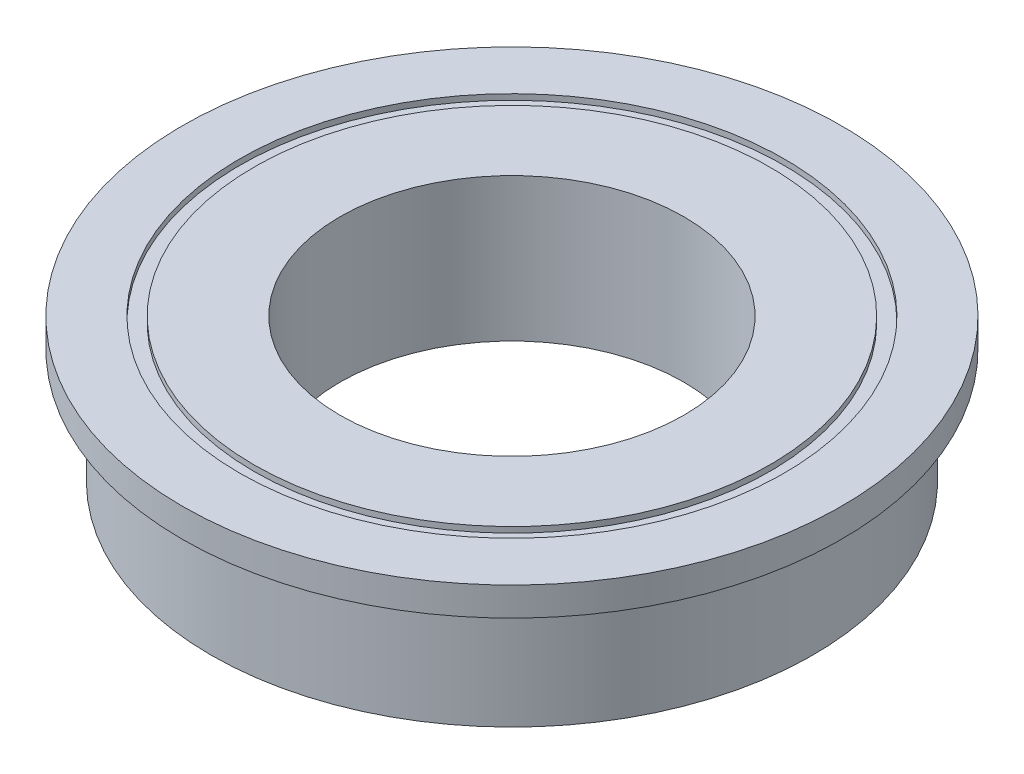
ISO-10303-21;
HEADER;
FILE_DESCRIPTION(('STEP AP214'),'2;1');
FILE_NAME('part.step','',(''),(''),'','','');
FILE_SCHEMA(('AUTOMOTIVE_DESIGN { 1 0 10303 214 1 1 1 1 }'));
ENDSEC;
DATA;
#1=APPLICATION_CONTEXT('core data for automotive mechanical design processes');
#2=APPLICATION_PROTOCOL_DEFINITION('international standard','automotive_design',2000,#1);
#3=PRODUCT_CONTEXT('',#1,'mechanical');
#4=PRODUCT('Part','Part','',(#3));
#5=PRODUCT_RELATED_PRODUCT_CATEGORY('part','',(#4));
#6=PRODUCT_DEFINITION_FORMATION('','',#4);
#7=PRODUCT_DEFINITION_CONTEXT('part definition',#1,'design');
#8=PRODUCT_DEFINITION('design','',#6,#7);
#9=PRODUCT_DEFINITION_SHAPE('','',#8);
#10=(LENGTH_UNIT() NAMED_UNIT(*) SI_UNIT(.MILLI.,.METRE.));
#11=(NAMED_UNIT(*) PLANE_ANGLE_UNIT() SI_UNIT($,.RADIAN.));
#12=(NAMED_UNIT(*) SI_UNIT($,.STERADIAN.) SOLID_ANGLE_UNIT());
#13=UNCERTAINTY_MEASURE_WITH_UNIT(LENGTH_MEASURE(1.E-05),#10,'distance_accuracy_value','');
#14=(GEOMETRIC_REPRESENTATION_CONTEXT(3) GLOBAL_UNCERTAINTY_ASSIGNED_CONTEXT((#13)) GLOBAL_UNIT_ASSIGNED_CONTEXT((#10,
#11,#12)) REPRESENTATION_CONTEXT('',''));
#15=CARTESIAN_POINT('',(0.,0.,0.));
#16=DIRECTION('',(0.,0.,1.));
#17=DIRECTION('',(1.,0.,0.));
#18=AXIS2_PLACEMENT_3D('',#15,#16,#17);
#19=CARTESIAN_POINT('',(0.,5.,0.));
#20=DIRECTION('',(0.,1.,0.));
#21=DIRECTION('',(0.,0.,1.));
#22=AXIS2_PLACEMENT_3D('',#19,#20,#21);
#23=PLANE('',#22);
#24=CARTESIAN_POINT('',(0.,5.,0.));
#25=DIRECTION('',(0.,1.,0.));
#26=DIRECTION('',(0.,0.,1.));
#27=AXIS2_PLACEMENT_3D('',#24,#25,#26);
#28=CIRCLE('',#27,6.);
#29=CARTESIAN_POINT('',(0.,5.,6.));
#30=VERTEX_POINT('',#29);
#31=EDGE_CURVE('E53',#30,#30,#28,.T.);
#32=ORIENTED_EDGE('',*,*,#31,.F.);
#33=EDGE_LOOP('',(#32));
#34=FACE_BOUND('',#33,.T.);
#35=CARTESIAN_POINT('',(0.,5.,0.));
#36=DIRECTION('',(0.,1.,0.));
#37=DIRECTION('',(0.,0.,1.));
#38=AXIS2_PLACEMENT_3D('',#35,#36,#37);
#39=CIRCLE('',#38,9.);
#40=CARTESIAN_POINT('',(0.,5.,9.));
#41=VERTEX_POINT('',#40);
#42=EDGE_CURVE('E77',#41,#41,#39,.T.);
#43=ORIENTED_EDGE('',*,*,#42,.T.);
#44=EDGE_LOOP('',(#43));
#45=FACE_BOUND('',#44,.T.);
#46=ADVANCED_FACE('F34',(#34,#45),#23,.T.);
#47=CARTESIAN_POINT('',(0.,0.,0.));
#48=DIRECTION('',(0.,1.,0.));
#49=DIRECTION('',(0.,0.,1.));
#50=AXIS2_PLACEMENT_3D('',#47,#48,#49);
#51=PLANE('',#50);
#52=CARTESIAN_POINT('',(0.,0.,0.));
#53=DIRECTION('',(0.,1.,0.));
#54=DIRECTION('',(0.,0.,1.));
#55=AXIS2_PLACEMENT_3D('',#52,#53,#54);
#56=CIRCLE('',#55,6.);
#57=CARTESIAN_POINT('',(0.,0.,6.));
#58=VERTEX_POINT('',#57);
#59=EDGE_CURVE('E45',#58,#58,#56,.T.);
#60=ORIENTED_EDGE('',*,*,#59,.T.);
#61=EDGE_LOOP('',(#60));
#62=FACE_BOUND('',#61,.T.);
#63=CARTESIAN_POINT('',(0.,0.,0.));
#64=DIRECTION('',(0.,-1.,0.));
#65=DIRECTION('',(0.,0.,-1.));
#66=AXIS2_PLACEMENT_3D('',#63,#64,#65);
#67=CIRCLE('',#66,9.);
#68=CARTESIAN_POINT('',(0.,0.,-9.));
#69=VERTEX_POINT('',#68);
#70=EDGE_CURVE('E65',#69,#69,#67,.T.);
#71=ORIENTED_EDGE('',*,*,#70,.T.);
#72=EDGE_LOOP('',(#71));
#73=FACE_BOUND('',#72,.T.);
#74=ADVANCED_FACE('F122',(#62,#73),#51,.F.);
#75=CARTESIAN_POINT('',(0.,0.,0.));
#76=DIRECTION('',(0.,-1.,0.));
#77=DIRECTION('',(0.,0.,-1.));
#78=AXIS2_PLACEMENT_3D('',#75,#76,#77);
#79=CIRCLE('',#78,9.5);
#80=CARTESIAN_POINT('',(0.,0.,-9.5));
#81=VERTEX_POINT('',#80);
#82=EDGE_CURVE('E59',#81,#81,#79,.T.);
#83=ORIENTED_EDGE('',*,*,#82,.F.);
#84=EDGE_LOOP('',(#83));
#85=FACE_BOUND('',#84,.T.);
#86=CARTESIAN_POINT('',(0.,0.,0.));
#87=DIRECTION('',(0.,1.,0.));
#88=DIRECTION('',(0.,0.,1.));
#89=AXIS2_PLACEMENT_3D('',#86,#87,#88);
#90=CIRCLE('',#89,10.5);
#91=CARTESIAN_POINT('',(0.,0.,10.5));
#92=VERTEX_POINT('',#91);
#93=EDGE_CURVE('E38',#92,#92,#90,.T.);
#94=ORIENTED_EDGE('',*,*,#93,.F.);
#95=EDGE_LOOP('',(#94));
#96=FACE_BOUND('',#95,.T.);
#97=ADVANCED_FACE('F127',(#85,#96),#51,.F.);
#98=CARTESIAN_POINT('',(0.,4.,0.));
#99=DIRECTION('',(0.,-1.,0.));
#100=DIRECTION('',(0.,0.,-1.));
#101=AXIS2_PLACEMENT_3D('',#98,#99,#100);
#102=CYLINDRICAL_SURFACE('',#101,10.5);
#103=CARTESIAN_POINT('',(0.,4.,0.));
#104=DIRECTION('',(0.,1.,0.));
#105=DIRECTION('',(0.,0.,1.));
#106=AXIS2_PLACEMENT_3D('',#103,#104,#105);
#107=CIRCLE('',#106,10.5);
#108=CARTESIAN_POINT('',(0.,4.,10.5));
#109=VERTEX_POINT('',#108);
#110=EDGE_CURVE('E10',#109,#109,#107,.T.);
#111=ORIENTED_EDGE('',*,*,#110,.F.);
#112=EDGE_LOOP('',(#111));
#113=FACE_BOUND('',#112,.T.);
#114=ORIENTED_EDGE('',*,*,#93,.T.);
#115=EDGE_LOOP('',(#114));
#116=FACE_BOUND('',#115,.T.);
#117=ADVANCED_FACE('F36',(#113,#116),#102,.T.);
#118=CARTESIAN_POINT('',(0.,4.,0.));
#119=DIRECTION('',(0.,-1.,0.));
#120=DIRECTION('',(0.,0.,-1.));
#121=AXIS2_PLACEMENT_3D('',#118,#119,#120);
#122=CYLINDRICAL_SURFACE('',#121,6.);
#123=ORIENTED_EDGE('',*,*,#59,.F.);
#124=EDGE_LOOP('',(#123));
#125=FACE_BOUND('',#124,.T.);
#126=ORIENTED_EDGE('',*,*,#31,.T.);
#127=EDGE_LOOP('',(#126));
#128=FACE_BOUND('',#127,.T.);
#129=ADVANCED_FACE('F114',(#125,#128),#122,.F.);
#130=CARTESIAN_POINT('',(0.,4.,0.));
#131=DIRECTION('',(0.,1.,0.));
#132=DIRECTION('',(0.,0.,1.));
#133=AXIS2_PLACEMENT_3D('',#130,#131,#132);
#134=PLANE('',#133);
#135=CARTESIAN_POINT('',(0.,4.,0.));
#136=DIRECTION('',(0.,1.,0.));
#137=DIRECTION('',(0.,0.,1.));
#138=AXIS2_PLACEMENT_3D('',#135,#136,#137);
#139=CIRCLE('',#138,11.5);
#140=CARTESIAN_POINT('',(0.,4.,11.5));
#141=VERTEX_POINT('',#140);
#142=EDGE_CURVE('E50',#141,#141,#139,.T.);
#143=ORIENTED_EDGE('',*,*,#142,.F.);
#144=EDGE_LOOP('',(#143));
#145=FACE_BOUND('',#144,.T.);
#146=ORIENTED_EDGE('',*,*,#110,.T.);
#147=EDGE_LOOP('',(#146));
#148=FACE_BOUND('',#147,.T.);
#149=ADVANCED_FACE('F103',(#145,#148),#134,.F.);
#150=CARTESIAN_POINT('',(0.,5.,0.));
#151=DIRECTION('',(0.,1.,0.));
#152=DIRECTION('',(0.,0.,1.));
#153=AXIS2_PLACEMENT_3D('',#150,#151,#152);
#154=CIRCLE('',#153,9.5);
#155=CARTESIAN_POINT('',(0.,5.,9.5));
#156=VERTEX_POINT('',#155);
#157=EDGE_CURVE('E71',#156,#156,#154,.T.);
#158=ORIENTED_EDGE('',*,*,#157,.F.);
#159=EDGE_LOOP('',(#158));
#160=FACE_BOUND('',#159,.T.);
#161=CARTESIAN_POINT('',(0.,5.,0.));
#162=DIRECTION('',(0.,1.,0.));
#163=DIRECTION('',(0.,0.,1.));
#164=AXIS2_PLACEMENT_3D('',#161,#162,#163);
#165=CIRCLE('',#164,11.5);
#166=CARTESIAN_POINT('',(0.,5.,11.5));
#167=VERTEX_POINT('',#166);
#168=EDGE_CURVE('E49',#167,#167,#165,.T.);
#169=ORIENTED_EDGE('',*,*,#168,.T.);
#170=EDGE_LOOP('',(#169));
#171=FACE_BOUND('',#170,.T.);
#172=ADVANCED_FACE('F99',(#160,#171),#23,.T.);
#173=CARTESIAN_POINT('',(0.,5.,0.));
#174=DIRECTION('',(0.,-1.,0.));
#175=DIRECTION('',(0.,0.,-1.));
#176=AXIS2_PLACEMENT_3D('',#173,#174,#175);
#177=CYLINDRICAL_SURFACE('',#176,11.5);
#178=ORIENTED_EDGE('',*,*,#168,.F.);
#179=EDGE_LOOP('',(#178));
#180=FACE_BOUND('',#179,.T.);
#181=ORIENTED_EDGE('',*,*,#142,.T.);
#182=EDGE_LOOP('',(#181));
#183=FACE_BOUND('',#182,.T.);
#184=ADVANCED_FACE('F102',(#180,#183),#177,.T.);
#185=CARTESIAN_POINT('',(0.,0.2,0.));
#186=DIRECTION('',(0.,-1.,0.));
#187=DIRECTION('',(0.,0.,-1.));
#188=AXIS2_PLACEMENT_3D('',#185,#186,#187);
#189=CYLINDRICAL_SURFACE('',#188,9.5);
#190=CARTESIAN_POINT('',(0.,0.2,0.));
#191=DIRECTION('',(0.,-1.,0.));
#192=DIRECTION('',(0.,0.,-1.));
#193=AXIS2_PLACEMENT_3D('',#190,#191,#192);
#194=CIRCLE('',#193,9.5);
#195=CARTESIAN_POINT('',(0.,0.2,-9.5));
#196=VERTEX_POINT('',#195);
#197=EDGE_CURVE('E58',#196,#196,#194,.T.);
#198=ORIENTED_EDGE('',*,*,#197,.F.);
#199=EDGE_LOOP('',(#198));
#200=FACE_BOUND('',#199,.T.);
#201=ORIENTED_EDGE('',*,*,#82,.T.);
#202=EDGE_LOOP('',(#201));
#203=FACE_BOUND('',#202,.T.);
#204=ADVANCED_FACE('F109',(#200,#203),#189,.F.);
#205=CARTESIAN_POINT('',(0.,0.2,0.));
#206=DIRECTION('',(0.,-1.,0.));
#207=DIRECTION('',(0.,0.,-1.));
#208=AXIS2_PLACEMENT_3D('',#205,#206,#207);
#209=PLANE('',#208);
#210=CARTESIAN_POINT('',(0.,0.2,0.));
#211=DIRECTION('',(0.,-1.,0.));
#212=DIRECTION('',(0.,0.,-1.));
#213=AXIS2_PLACEMENT_3D('',#210,#211,#212);
#214=CIRCLE('',#213,9.);
#215=CARTESIAN_POINT('',(0.,0.2,-9.));
#216=VERTEX_POINT('',#215);
#217=EDGE_CURVE('E62',#216,#216,#214,.T.);
#218=ORIENTED_EDGE('',*,*,#217,.F.);
#219=EDGE_LOOP('',(#218));
#220=FACE_BOUND('',#219,.T.);
#221=ORIENTED_EDGE('',*,*,#197,.T.);
#222=EDGE_LOOP('',(#221));
#223=FACE_BOUND('',#222,.T.);
#224=ADVANCED_FACE('F134',(#220,#223),#209,.T.);
#225=CARTESIAN_POINT('',(0.,0.2,0.));
#226=DIRECTION('',(0.,-1.,0.));
#227=DIRECTION('',(0.,0.,-1.));
#228=AXIS2_PLACEMENT_3D('',#225,#226,#227);
#229=CYLINDRICAL_SURFACE('',#228,9.);
#230=ORIENTED_EDGE('',*,*,#217,.T.);
#231=EDGE_LOOP('',(#230));
#232=FACE_BOUND('',#231,.T.);
#233=ORIENTED_EDGE('',*,*,#70,.F.);
#234=EDGE_LOOP('',(#233));
#235=FACE_BOUND('',#234,.T.);
#236=ADVANCED_FACE('F95',(#232,#235),#229,.T.);
#237=CARTESIAN_POINT('',(0.,4.8,0.));
#238=DIRECTION('',(0.,1.,0.));
#239=DIRECTION('',(0.,0.,1.));
#240=AXIS2_PLACEMENT_3D('',#237,#238,#239);
#241=CYLINDRICAL_SURFACE('',#240,9.5);
#242=CARTESIAN_POINT('',(0.,4.8,0.));
#243=DIRECTION('',(0.,1.,0.));
#244=DIRECTION('',(0.,0.,1.));
#245=AXIS2_PLACEMENT_3D('',#242,#243,#244);
#246=CIRCLE('',#245,9.5);
#247=CARTESIAN_POINT('',(0.,4.8,9.5));
#248=VERTEX_POINT('',#247);
#249=EDGE_CURVE('E68',#248,#248,#246,.T.);
#250=ORIENTED_EDGE('',*,*,#249,.F.);
#251=EDGE_LOOP('',(#250));
#252=FACE_BOUND('',#251,.T.);
#253=ORIENTED_EDGE('',*,*,#157,.T.);
#254=EDGE_LOOP('',(#253));
#255=FACE_BOUND('',#254,.T.);
#256=ADVANCED_FACE('F89',(#252,#255),#241,.F.);
#257=CARTESIAN_POINT('',(0.,4.8,0.));
#258=DIRECTION('',(0.,1.,0.));
#259=DIRECTION('',(0.,0.,1.));
#260=AXIS2_PLACEMENT_3D('',#257,#258,#259);
#261=PLANE('',#260);
#262=CARTESIAN_POINT('',(0.,4.8,0.));
#263=DIRECTION('',(0.,1.,0.));
#264=DIRECTION('',(0.,0.,1.));
#265=AXIS2_PLACEMENT_3D('',#262,#263,#264);
#266=CIRCLE('',#265,9.);
#267=CARTESIAN_POINT('',(0.,4.8,9.));
#268=VERTEX_POINT('',#267);
#269=EDGE_CURVE('E74',#268,#268,#266,.T.);
#270=ORIENTED_EDGE('',*,*,#269,.F.);
#271=EDGE_LOOP('',(#270));
#272=FACE_BOUND('',#271,.T.);
#273=ORIENTED_EDGE('',*,*,#249,.T.);
#274=EDGE_LOOP('',(#273));
#275=FACE_BOUND('',#274,.T.);
#276=ADVANCED_FACE('F86',(#272,#275),#261,.T.);
#277=CARTESIAN_POINT('',(0.,4.8,0.));
#278=DIRECTION('',(0.,1.,0.));
#279=DIRECTION('',(0.,0.,1.));
#280=AXIS2_PLACEMENT_3D('',#277,#278,#279);
#281=CYLINDRICAL_SURFACE('',#280,9.);
#282=ORIENTED_EDGE('',*,*,#269,.T.);
#283=EDGE_LOOP('',(#282));
#284=FACE_BOUND('',#283,.T.);
#285=ORIENTED_EDGE('',*,*,#42,.F.);
#286=EDGE_LOOP('',(#285));
#287=FACE_BOUND('',#286,.T.);
#288=ADVANCED_FACE('F83',(#284,#287),#281,.T.);
#289=CLOSED_SHELL('',(#46,#74,#97,#117,#129,#149,#172,#184,#204,#224,#236,#256,#276,#288));
#290=MANIFOLD_SOLID_BREP('B2',#289);
#291=ADVANCED_BREP_SHAPE_REPRESENTATION('',(#18,#290),#14);
#292=SHAPE_DEFINITION_REPRESENTATION(#9,#291);
ENDSEC;
END-ISO-10303-21;
